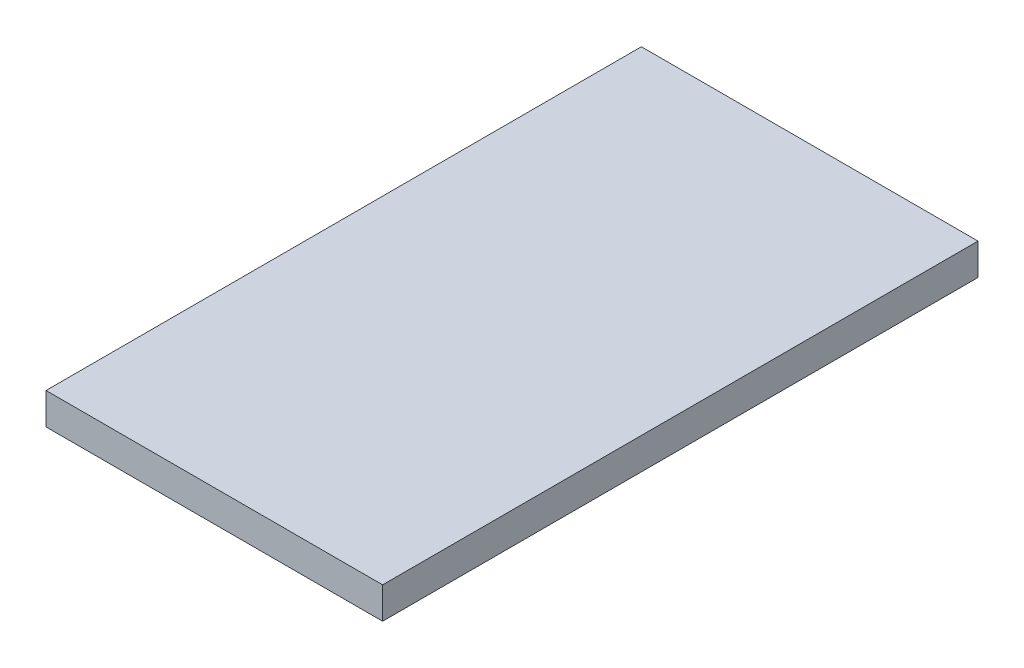
ISO-10303-21;
HEADER;
FILE_DESCRIPTION(('STEP AP214'),'2;1');
FILE_NAME('part.step','',(''),(''),'','','');
FILE_SCHEMA(('AUTOMOTIVE_DESIGN { 1 0 10303 214 1 1 1 1 }'));
ENDSEC;
DATA;
#1=APPLICATION_CONTEXT('core data for automotive mechanical design processes');
#2=APPLICATION_PROTOCOL_DEFINITION('international standard','automotive_design',2000,#1);
#3=PRODUCT_CONTEXT('',#1,'mechanical');
#4=PRODUCT('Part','Part','',(#3));
#5=PRODUCT_RELATED_PRODUCT_CATEGORY('part','',(#4));
#6=PRODUCT_DEFINITION_FORMATION('','',#4);
#7=PRODUCT_DEFINITION_CONTEXT('part definition',#1,'design');
#8=PRODUCT_DEFINITION('design','',#6,#7);
#9=PRODUCT_DEFINITION_SHAPE('','',#8);
#10=(LENGTH_UNIT() NAMED_UNIT(*) SI_UNIT(.MILLI.,.METRE.));
#11=(NAMED_UNIT(*) PLANE_ANGLE_UNIT() SI_UNIT($,.RADIAN.));
#12=(NAMED_UNIT(*) SI_UNIT($,.STERADIAN.) SOLID_ANGLE_UNIT());
#13=UNCERTAINTY_MEASURE_WITH_UNIT(LENGTH_MEASURE(1.E-05),#10,'distance_accuracy_value','');
#14=(GEOMETRIC_REPRESENTATION_CONTEXT(3) GLOBAL_UNCERTAINTY_ASSIGNED_CONTEXT((#13)) GLOBAL_UNIT_ASSIGNED_CONTEXT((#10,
#11,#12)) REPRESENTATION_CONTEXT('',''));
#15=CARTESIAN_POINT('',(0.,0.,0.));
#16=DIRECTION('',(0.,0.,1.));
#17=DIRECTION('',(1.,0.,0.));
#18=AXIS2_PLACEMENT_3D('',#15,#16,#17);
#19=CARTESIAN_POINT('',(-73.1886027910602,19.05,132.266716182801));
#20=DIRECTION('',(0.,0.,-1.));
#21=DIRECTION('',(-1.,0.,0.));
#22=AXIS2_PLACEMENT_3D('',#19,#20,#21);
#23=PLANE('',#22);
#24=DIRECTION('',(1.,0.,0.));
#25=VECTOR('',#24,1.);
#26=CARTESIAN_POINT('',(-73.1886027910602,0.,132.266716182801));
#27=LINE('',#26,#25);
#28=CARTESIAN_POINT('',(-73.1886027910602,0.,132.266716182801));
#29=VERTEX_POINT('',#28);
#30=CARTESIAN_POINT('',(130.01139720894,0.,132.266716182801));
#31=VERTEX_POINT('',#30);
#32=EDGE_CURVE('E98',#29,#31,#27,.T.);
#33=ORIENTED_EDGE('',*,*,#32,.T.);
#34=DIRECTION('',(0.,-1.,0.));
#35=VECTOR('',#34,1.);
#36=CARTESIAN_POINT('',(130.01139720894,19.05,132.266716182801));
#37=LINE('',#36,#35);
#38=CARTESIAN_POINT('',(130.01139720894,19.05,132.266716182801));
#39=VERTEX_POINT('',#38);
#40=EDGE_CURVE('E11',#39,#31,#37,.T.);
#41=ORIENTED_EDGE('',*,*,#40,.F.);
#42=DIRECTION('',(1.,0.,0.));
#43=VECTOR('',#42,1.);
#44=CARTESIAN_POINT('',(-73.1886027910602,19.05,132.266716182801));
#45=LINE('',#44,#43);
#46=CARTESIAN_POINT('',(-73.1886027910602,19.05,132.266716182801));
#47=VERTEX_POINT('',#46);
#48=EDGE_CURVE('E75',#47,#39,#45,.T.);
#49=ORIENTED_EDGE('',*,*,#48,.F.);
#50=DIRECTION('',(0.,-1.,0.));
#51=VECTOR('',#50,1.);
#52=CARTESIAN_POINT('',(-73.1886027910602,19.05,132.266716182801));
#53=LINE('',#52,#51);
#54=EDGE_CURVE('E94',#47,#29,#53,.T.);
#55=ORIENTED_EDGE('',*,*,#54,.T.);
#56=EDGE_LOOP('',(#33,#41,#49,#55));
#57=FACE_BOUND('',#56,.T.);
#58=ADVANCED_FACE('F36',(#57),#23,.F.);
#59=CARTESIAN_POINT('',(130.01139720894,19.05,-227.143283817199));
#60=DIRECTION('',(1.,0.,0.));
#61=DIRECTION('',(0.,0.,-1.));
#62=AXIS2_PLACEMENT_3D('',#59,#60,#61);
#63=PLANE('',#62);
#64=DIRECTION('',(0.,0.,1.));
#65=VECTOR('',#64,1.);
#66=CARTESIAN_POINT('',(130.01139720894,0.,-227.143283817199));
#67=LINE('',#66,#65);
#68=CARTESIAN_POINT('',(130.01139720894,0.,-227.143283817199));
#69=VERTEX_POINT('',#68);
#70=EDGE_CURVE('E84',#69,#31,#67,.T.);
#71=ORIENTED_EDGE('',*,*,#70,.F.);
#72=DIRECTION('',(0.,-1.,0.));
#73=VECTOR('',#72,1.);
#74=CARTESIAN_POINT('',(130.01139720894,19.05,-227.143283817199));
#75=LINE('',#74,#73);
#76=CARTESIAN_POINT('',(130.01139720894,19.05,-227.143283817199));
#77=VERTEX_POINT('',#76);
#78=EDGE_CURVE('E44',#77,#69,#75,.T.);
#79=ORIENTED_EDGE('',*,*,#78,.F.);
#80=DIRECTION('',(0.,0.,1.));
#81=VECTOR('',#80,1.);
#82=CARTESIAN_POINT('',(130.01139720894,19.05,-227.143283817199));
#83=LINE('',#82,#81);
#84=EDGE_CURVE('E82',#77,#39,#83,.T.);
#85=ORIENTED_EDGE('',*,*,#84,.T.);
#86=ORIENTED_EDGE('',*,*,#40,.T.);
#87=EDGE_LOOP('',(#71,#79,#85,#86));
#88=FACE_BOUND('',#87,.T.);
#89=ADVANCED_FACE('F81',(#88),#63,.T.);
#90=CARTESIAN_POINT('',(-73.1886027910602,19.05,-227.143283817199));
#91=DIRECTION('',(0.,0.,-1.));
#92=DIRECTION('',(-1.,0.,0.));
#93=AXIS2_PLACEMENT_3D('',#90,#91,#92);
#94=PLANE('',#93);
#95=DIRECTION('',(1.,0.,0.));
#96=VECTOR('',#95,1.);
#97=CARTESIAN_POINT('',(-73.1886027910602,0.,-227.143283817199));
#98=LINE('',#97,#96);
#99=CARTESIAN_POINT('',(-73.1886027910602,0.,-227.143283817199));
#100=VERTEX_POINT('',#99);
#101=EDGE_CURVE('E102',#100,#69,#98,.T.);
#102=ORIENTED_EDGE('',*,*,#101,.F.);
#103=DIRECTION('',(0.,-1.,0.));
#104=VECTOR('',#103,1.);
#105=CARTESIAN_POINT('',(-73.1886027910602,19.05,-227.143283817199));
#106=LINE('',#105,#104);
#107=CARTESIAN_POINT('',(-73.1886027910602,19.05,-227.143283817199));
#108=VERTEX_POINT('',#107);
#109=EDGE_CURVE('E67',#108,#100,#106,.T.);
#110=ORIENTED_EDGE('',*,*,#109,.F.);
#111=DIRECTION('',(1.,0.,0.));
#112=VECTOR('',#111,1.);
#113=CARTESIAN_POINT('',(-73.1886027910602,19.05,-227.143283817199));
#114=LINE('',#113,#112);
#115=EDGE_CURVE('E90',#108,#77,#114,.T.);
#116=ORIENTED_EDGE('',*,*,#115,.T.);
#117=ORIENTED_EDGE('',*,*,#78,.T.);
#118=EDGE_LOOP('',(#102,#110,#116,#117));
#119=FACE_BOUND('',#118,.T.);
#120=ADVANCED_FACE('F92',(#119),#94,.T.);
#121=CARTESIAN_POINT('',(-73.1886027910602,19.05,-227.143283817199));
#122=DIRECTION('',(1.,0.,0.));
#123=DIRECTION('',(0.,0.,-1.));
#124=AXIS2_PLACEMENT_3D('',#121,#122,#123);
#125=PLANE('',#124);
#126=DIRECTION('',(0.,0.,1.));
#127=VECTOR('',#126,1.);
#128=CARTESIAN_POINT('',(-73.1886027910602,0.,-227.143283817199));
#129=LINE('',#128,#127);
#130=EDGE_CURVE('E70',#100,#29,#129,.T.);
#131=ORIENTED_EDGE('',*,*,#130,.T.);
#132=ORIENTED_EDGE('',*,*,#54,.F.);
#133=DIRECTION('',(0.,0.,1.));
#134=VECTOR('',#133,1.);
#135=CARTESIAN_POINT('',(-73.1886027910602,19.05,-227.143283817199));
#136=LINE('',#135,#134);
#137=EDGE_CURVE('E52',#108,#47,#136,.T.);
#138=ORIENTED_EDGE('',*,*,#137,.F.);
#139=ORIENTED_EDGE('',*,*,#109,.T.);
#140=EDGE_LOOP('',(#131,#132,#138,#139));
#141=FACE_BOUND('',#140,.T.);
#142=ADVANCED_FACE('F115',(#141),#125,.F.);
#143=CARTESIAN_POINT('',(0.,19.05,0.));
#144=DIRECTION('',(0.,-1.,0.));
#145=DIRECTION('',(0.,0.,-1.));
#146=AXIS2_PLACEMENT_3D('',#143,#144,#145);
#147=PLANE('',#146);
#148=ORIENTED_EDGE('',*,*,#48,.T.);
#149=ORIENTED_EDGE('',*,*,#84,.F.);
#150=ORIENTED_EDGE('',*,*,#115,.F.);
#151=ORIENTED_EDGE('',*,*,#137,.T.);
#152=EDGE_LOOP('',(#148,#149,#150,#151));
#153=FACE_BOUND('',#152,.T.);
#154=ADVANCED_FACE('F89',(#153),#147,.F.);
#155=CARTESIAN_POINT('',(0.,0.,0.));
#156=DIRECTION('',(0.,-1.,0.));
#157=DIRECTION('',(0.,0.,-1.));
#158=AXIS2_PLACEMENT_3D('',#155,#156,#157);
#159=PLANE('',#158);
#160=ORIENTED_EDGE('',*,*,#32,.F.);
#161=ORIENTED_EDGE('',*,*,#130,.F.);
#162=ORIENTED_EDGE('',*,*,#101,.T.);
#163=ORIENTED_EDGE('',*,*,#70,.T.);
#164=EDGE_LOOP('',(#160,#161,#162,#163));
#165=FACE_BOUND('',#164,.T.);
#166=ADVANCED_FACE('F109',(#165),#159,.T.);
#167=CLOSED_SHELL('',(#58,#89,#120,#142,#154,#166));
#168=MANIFOLD_SOLID_BREP('B2',#167);
#169=ADVANCED_BREP_SHAPE_REPRESENTATION('',(#18,#168),#14);
#170=SHAPE_DEFINITION_REPRESENTATION(#9,#169);
ENDSEC;
END-ISO-10303-21;
